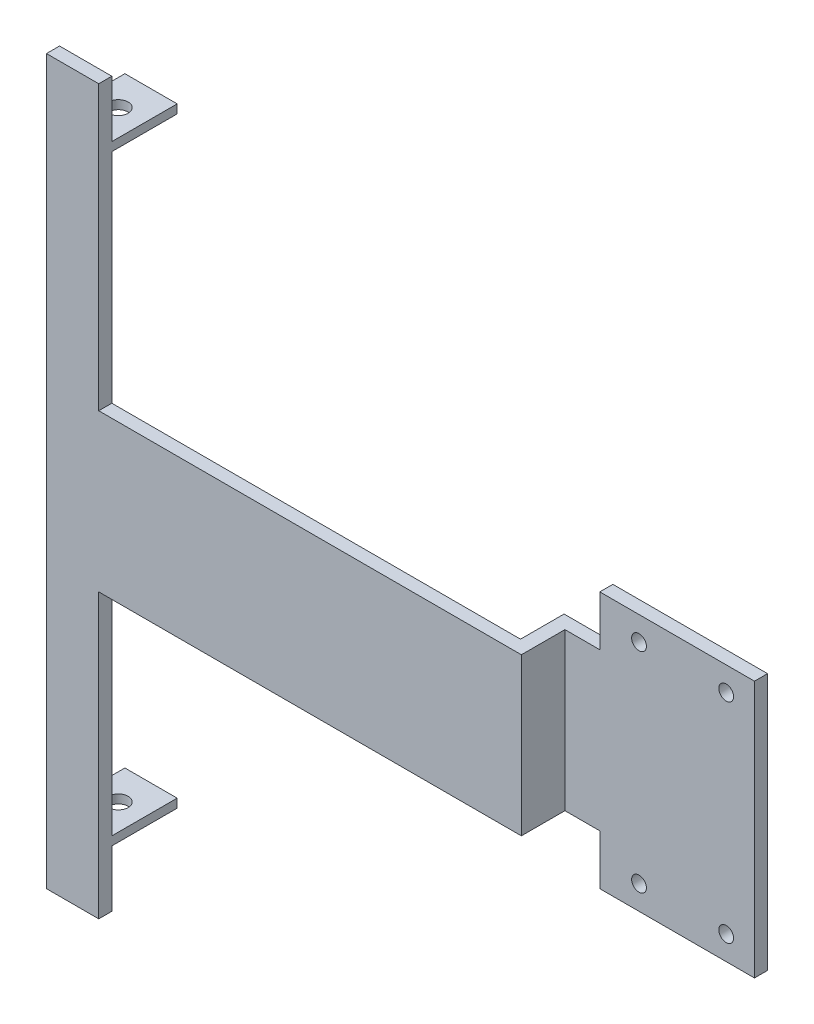
ISO-10303-21;
HEADER;
FILE_DESCRIPTION(('STEP AP214'),'2;1');
FILE_NAME('part.step','',(''),(''),'','','');
FILE_SCHEMA(('AUTOMOTIVE_DESIGN { 1 0 10303 214 1 1 1 1 }'));
ENDSEC;
DATA;
#1=APPLICATION_CONTEXT('core data for automotive mechanical design processes');
#2=APPLICATION_PROTOCOL_DEFINITION('international standard','automotive_design',2000,#1);
#3=PRODUCT_CONTEXT('',#1,'mechanical');
#4=PRODUCT('Part','Part','',(#3));
#5=PRODUCT_RELATED_PRODUCT_CATEGORY('part','',(#4));
#6=PRODUCT_DEFINITION_FORMATION('','',#4);
#7=PRODUCT_DEFINITION_CONTEXT('part definition',#1,'design');
#8=PRODUCT_DEFINITION('design','',#6,#7);
#9=PRODUCT_DEFINITION_SHAPE('','',#8);
#10=(LENGTH_UNIT() NAMED_UNIT(*) SI_UNIT(.MILLI.,.METRE.));
#11=(NAMED_UNIT(*) PLANE_ANGLE_UNIT() SI_UNIT($,.RADIAN.));
#12=(NAMED_UNIT(*) SI_UNIT($,.STERADIAN.) SOLID_ANGLE_UNIT());
#13=UNCERTAINTY_MEASURE_WITH_UNIT(LENGTH_MEASURE(1.E-05),#10,'distance_accuracy_value','');
#14=(GEOMETRIC_REPRESENTATION_CONTEXT(3) GLOBAL_UNCERTAINTY_ASSIGNED_CONTEXT((#13)) GLOBAL_UNIT_ASSIGNED_CONTEXT((#10,
#11,#12)) REPRESENTATION_CONTEXT('',''));
#15=CARTESIAN_POINT('',(0.,0.,0.));
#16=DIRECTION('',(0.,0.,1.));
#17=DIRECTION('',(1.,0.,0.));
#18=AXIS2_PLACEMENT_3D('',#15,#16,#17);
#19=CARTESIAN_POINT('',(46.,0.,120.));
#20=DIRECTION('',(1.,0.,0.));
#21=DIRECTION('',(0.,0.,-1.));
#22=AXIS2_PLACEMENT_3D('',#19,#20,#21);
#23=PLANE('',#22);
#24=DIRECTION('',(0.,0.,1.));
#25=VECTOR('',#24,1.);
#26=CARTESIAN_POINT('',(46.,-83.,120.));
#27=LINE('',#26,#25);
#28=CARTESIAN_POINT('',(46.,-83.,120.));
#29=VERTEX_POINT('',#28);
#30=CARTESIAN_POINT('',(46.,-83.,123.));
#31=VERTEX_POINT('',#30);
#32=EDGE_CURVE('E274',#29,#31,#27,.T.);
#33=ORIENTED_EDGE('',*,*,#32,.F.);
#34=DIRECTION('',(0.,1.,0.));
#35=VECTOR('',#34,1.);
#36=CARTESIAN_POINT('',(46.,0.,120.));
#37=LINE('',#36,#35);
#38=CARTESIAN_POINT('',(46.,-70.,120.));
#39=VERTEX_POINT('',#38);
#40=EDGE_CURVE('E354',#29,#39,#37,.T.);
#41=ORIENTED_EDGE('',*,*,#40,.T.);
#42=DIRECTION('',(0.,0.,1.));
#43=VECTOR('',#42,1.);
#44=CARTESIAN_POINT('',(46.,-70.,105.));
#45=LINE('',#44,#43);
#46=CARTESIAN_POINT('',(46.,-70.,105.));
#47=VERTEX_POINT('',#46);
#48=EDGE_CURVE('E330',#47,#39,#45,.T.);
#49=ORIENTED_EDGE('',*,*,#48,.F.);
#50=DIRECTION('',(0.,1.,0.));
#51=VECTOR('',#50,1.);
#52=CARTESIAN_POINT('',(46.,-69.,105.));
#53=LINE('',#52,#51);
#54=CARTESIAN_POINT('',(46.,-68.,105.));
#55=VERTEX_POINT('',#54);
#56=EDGE_CURVE('E327',#47,#55,#53,.T.);
#57=ORIENTED_EDGE('',*,*,#56,.T.);
#58=DIRECTION('',(0.,0.,1.));
#59=VECTOR('',#58,1.);
#60=CARTESIAN_POINT('',(46.,-68.,105.));
#61=LINE('',#60,#59);
#62=CARTESIAN_POINT('',(46.,-68.,120.));
#63=VERTEX_POINT('',#62);
#64=EDGE_CURVE('E338',#55,#63,#61,.T.);
#65=ORIENTED_EDGE('',*,*,#64,.T.);
#66=CARTESIAN_POINT('',(46.,-18.,120.));
#67=VERTEX_POINT('',#66);
#68=EDGE_CURVE('E357',#63,#67,#37,.T.);
#69=ORIENTED_EDGE('',*,*,#68,.T.);
#70=DIRECTION('',(0.,0.,-1.));
#71=VECTOR('',#70,1.);
#72=CARTESIAN_POINT('',(46.,-18.,120.));
#73=LINE('',#72,#71);
#74=CARTESIAN_POINT('',(46.,-18.,123.));
#75=VERTEX_POINT('',#74);
#76=EDGE_CURVE('E371',#75,#67,#73,.T.);
#77=ORIENTED_EDGE('',*,*,#76,.F.);
#78=DIRECTION('',(0.,-1.,0.));
#79=VECTOR('',#78,1.);
#80=CARTESIAN_POINT('',(46.,0.,123.));
#81=LINE('',#80,#79);
#82=EDGE_CURVE('E356',#75,#31,#81,.T.);
#83=ORIENTED_EDGE('',*,*,#82,.T.);
#84=EDGE_LOOP('',(#33,#41,#49,#57,#65,#69,#77,#83));
#85=FACE_BOUND('',#84,.T.);
#86=ADVANCED_FACE('F15',(#85),#23,.T.);
#87=CARTESIAN_POINT('',(40.,0.,120.));
#88=DIRECTION('',(0.,0.,-1.));
#89=DIRECTION('',(-1.,0.,0.));
#90=AXIS2_PLACEMENT_3D('',#87,#88,#89);
#91=PLANE('',#90);
#92=DIRECTION('',(0.,1.,0.));
#93=VECTOR('',#92,1.);
#94=CARTESIAN_POINT('',(139.8,0.,120.));
#95=LINE('',#94,#93);
#96=CARTESIAN_POINT('',(139.8,-18.,120.));
#97=VERTEX_POINT('',#96);
#98=CARTESIAN_POINT('',(139.8,18.,120.));
#99=VERTEX_POINT('',#98);
#100=EDGE_CURVE('E261',#97,#99,#95,.T.);
#101=ORIENTED_EDGE('',*,*,#100,.F.);
#102=DIRECTION('',(1.,0.,0.));
#103=VECTOR('',#102,1.);
#104=CARTESIAN_POINT('',(103.,-18.,120.));
#105=LINE('',#104,#103);
#106=EDGE_CURVE('E276',#67,#97,#105,.T.);
#107=ORIENTED_EDGE('',*,*,#106,.F.);
#108=ORIENTED_EDGE('',*,*,#68,.F.);
#109=DIRECTION('',(1.,0.,0.));
#110=VECTOR('',#109,1.);
#111=CARTESIAN_POINT('',(40.,-68.,120.));
#112=LINE('',#111,#110);
#113=CARTESIAN_POINT('',(34.,-68.,120.));
#114=VERTEX_POINT('',#113);
#115=EDGE_CURVE('E346',#114,#63,#112,.T.);
#116=ORIENTED_EDGE('',*,*,#115,.F.);
#117=DIRECTION('',(0.,-1.,0.));
#118=VECTOR('',#117,1.);
#119=CARTESIAN_POINT('',(34.,0.,120.));
#120=LINE('',#119,#118);
#121=CARTESIAN_POINT('',(34.,68.,120.));
#122=VERTEX_POINT('',#121);
#123=EDGE_CURVE('E362',#122,#114,#120,.T.);
#124=ORIENTED_EDGE('',*,*,#123,.F.);
#125=DIRECTION('',(-1.,0.,0.));
#126=VECTOR('',#125,1.);
#127=CARTESIAN_POINT('',(40.,68.,120.));
#128=LINE('',#127,#126);
#129=CARTESIAN_POINT('',(46.,68.,120.));
#130=VERTEX_POINT('',#129);
#131=EDGE_CURVE('E317',#130,#122,#128,.T.);
#132=ORIENTED_EDGE('',*,*,#131,.F.);
#133=CARTESIAN_POINT('',(46.,18.,120.));
#134=VERTEX_POINT('',#133);
#135=EDGE_CURVE('E358',#134,#130,#37,.T.);
#136=ORIENTED_EDGE('',*,*,#135,.F.);
#137=DIRECTION('',(-1.,0.,0.));
#138=VECTOR('',#137,1.);
#139=CARTESIAN_POINT('',(103.,18.,120.));
#140=LINE('',#139,#138);
#141=EDGE_CURVE('E279',#99,#134,#140,.T.);
#142=ORIENTED_EDGE('',*,*,#141,.F.);
#143=EDGE_LOOP('',(#101,#107,#108,#116,#124,#132,#136,#142));
#144=FACE_BOUND('',#143,.T.);
#145=ADVANCED_FACE('F429',(#144),#91,.T.);
#146=DIRECTION('',(1.,0.,0.));
#147=VECTOR('',#146,1.);
#148=CARTESIAN_POINT('',(40.,-83.,120.));
#149=LINE('',#148,#147);
#150=CARTESIAN_POINT('',(34.,-83.,120.));
#151=VERTEX_POINT('',#150);
#152=EDGE_CURVE('E272',#151,#29,#149,.T.);
#153=ORIENTED_EDGE('',*,*,#152,.F.);
#154=CARTESIAN_POINT('',(34.,-70.,120.));
#155=VERTEX_POINT('',#154);
#156=EDGE_CURVE('E353',#155,#151,#120,.T.);
#157=ORIENTED_EDGE('',*,*,#156,.F.);
#158=DIRECTION('',(-1.,0.,0.));
#159=VECTOR('',#158,1.);
#160=CARTESIAN_POINT('',(40.,-70.,120.));
#161=LINE('',#160,#159);
#162=EDGE_CURVE('E351',#39,#155,#161,.T.);
#163=ORIENTED_EDGE('',*,*,#162,.F.);
#164=ORIENTED_EDGE('',*,*,#40,.F.);
#165=EDGE_LOOP('',(#153,#157,#163,#164));
#166=FACE_BOUND('',#165,.T.);
#167=ADVANCED_FACE('F438',(#166),#91,.T.);
#168=CARTESIAN_POINT('',(40.,0.,123.));
#169=DIRECTION('',(0.,0.,1.));
#170=DIRECTION('',(1.,0.,0.));
#171=AXIS2_PLACEMENT_3D('',#168,#169,#170);
#172=PLANE('',#171);
#173=ORIENTED_EDGE('',*,*,#82,.F.);
#174=DIRECTION('',(-1.,0.,0.));
#175=VECTOR('',#174,1.);
#176=CARTESIAN_POINT('',(103.,-18.,123.));
#177=LINE('',#176,#175);
#178=CARTESIAN_POINT('',(143.,-18.,123.));
#179=VERTEX_POINT('',#178);
#180=EDGE_CURVE('E283',#179,#75,#177,.T.);
#181=ORIENTED_EDGE('',*,*,#180,.F.);
#182=DIRECTION('',(0.,-1.,0.));
#183=VECTOR('',#182,1.);
#184=CARTESIAN_POINT('',(143.,0.,123.));
#185=LINE('',#184,#183);
#186=CARTESIAN_POINT('',(143.,18.,123.));
#187=VERTEX_POINT('',#186);
#188=EDGE_CURVE('E258',#187,#179,#185,.T.);
#189=ORIENTED_EDGE('',*,*,#188,.F.);
#190=DIRECTION('',(1.,0.,0.));
#191=VECTOR('',#190,1.);
#192=CARTESIAN_POINT('',(103.,18.,123.));
#193=LINE('',#192,#191);
#194=CARTESIAN_POINT('',(46.,18.,123.));
#195=VERTEX_POINT('',#194);
#196=EDGE_CURVE('E281',#195,#187,#193,.T.);
#197=ORIENTED_EDGE('',*,*,#196,.F.);
#198=CARTESIAN_POINT('',(46.,83.,123.));
#199=VERTEX_POINT('',#198);
#200=EDGE_CURVE('E363',#199,#195,#81,.T.);
#201=ORIENTED_EDGE('',*,*,#200,.F.);
#202=DIRECTION('',(1.,0.,0.));
#203=VECTOR('',#202,1.);
#204=CARTESIAN_POINT('',(40.,83.,123.));
#205=LINE('',#204,#203);
#206=CARTESIAN_POINT('',(34.,83.,123.));
#207=VERTEX_POINT('',#206);
#208=EDGE_CURVE('E268',#207,#199,#205,.T.);
#209=ORIENTED_EDGE('',*,*,#208,.F.);
#210=DIRECTION('',(0.,1.,0.));
#211=VECTOR('',#210,1.);
#212=CARTESIAN_POINT('',(34.,0.,123.));
#213=LINE('',#212,#211);
#214=CARTESIAN_POINT('',(34.,-83.,123.));
#215=VERTEX_POINT('',#214);
#216=EDGE_CURVE('E365',#215,#207,#213,.T.);
#217=ORIENTED_EDGE('',*,*,#216,.F.);
#218=DIRECTION('',(-1.,0.,0.));
#219=VECTOR('',#218,1.);
#220=CARTESIAN_POINT('',(40.,-83.,123.));
#221=LINE('',#220,#219);
#222=EDGE_CURVE('E270',#31,#215,#221,.T.);
#223=ORIENTED_EDGE('',*,*,#222,.F.);
#224=EDGE_LOOP('',(#173,#181,#189,#197,#201,#209,#217,#223));
#225=FACE_BOUND('',#224,.T.);
#226=ADVANCED_FACE('F17',(#225),#172,.T.);
#227=CARTESIAN_POINT('',(34.,0.,120.));
#228=DIRECTION('',(-1.,0.,0.));
#229=DIRECTION('',(0.,0.,1.));
#230=AXIS2_PLACEMENT_3D('',#227,#228,#229);
#231=PLANE('',#230);
#232=DIRECTION('',(0.,0.,1.));
#233=VECTOR('',#232,1.);
#234=CARTESIAN_POINT('',(34.,83.,120.));
#235=LINE('',#234,#233);
#236=CARTESIAN_POINT('',(34.,83.,120.));
#237=VERTEX_POINT('',#236);
#238=EDGE_CURVE('E266',#237,#207,#235,.T.);
#239=ORIENTED_EDGE('',*,*,#238,.F.);
#240=CARTESIAN_POINT('',(34.,70.,120.));
#241=VERTEX_POINT('',#240);
#242=EDGE_CURVE('E359',#237,#241,#120,.T.);
#243=ORIENTED_EDGE('',*,*,#242,.T.);
#244=DIRECTION('',(0.,0.,1.));
#245=VECTOR('',#244,1.);
#246=CARTESIAN_POINT('',(34.,70.,105.));
#247=LINE('',#246,#245);
#248=CARTESIAN_POINT('',(34.,70.,105.));
#249=VERTEX_POINT('',#248);
#250=EDGE_CURVE('E306',#249,#241,#247,.T.);
#251=ORIENTED_EDGE('',*,*,#250,.F.);
#252=DIRECTION('',(0.,-1.,0.));
#253=VECTOR('',#252,1.);
#254=CARTESIAN_POINT('',(34.,69.,105.));
#255=LINE('',#254,#253);
#256=CARTESIAN_POINT('',(34.,68.,105.));
#257=VERTEX_POINT('',#256);
#258=EDGE_CURVE('E292',#249,#257,#255,.T.);
#259=ORIENTED_EDGE('',*,*,#258,.T.);
#260=DIRECTION('',(0.,0.,1.));
#261=VECTOR('',#260,1.);
#262=CARTESIAN_POINT('',(34.,68.,105.));
#263=LINE('',#262,#261);
#264=EDGE_CURVE('E309',#257,#122,#263,.T.);
#265=ORIENTED_EDGE('',*,*,#264,.T.);
#266=ORIENTED_EDGE('',*,*,#123,.T.);
#267=DIRECTION('',(0.,0.,1.));
#268=VECTOR('',#267,1.);
#269=CARTESIAN_POINT('',(34.,-68.,105.));
#270=LINE('',#269,#268);
#271=CARTESIAN_POINT('',(34.,-68.,105.));
#272=VERTEX_POINT('',#271);
#273=EDGE_CURVE('E340',#272,#114,#270,.T.);
#274=ORIENTED_EDGE('',*,*,#273,.F.);
#275=DIRECTION('',(0.,-1.,0.));
#276=VECTOR('',#275,1.);
#277=CARTESIAN_POINT('',(34.,-69.,105.));
#278=LINE('',#277,#276);
#279=CARTESIAN_POINT('',(34.,-70.,105.));
#280=VERTEX_POINT('',#279);
#281=EDGE_CURVE('E326',#272,#280,#278,.T.);
#282=ORIENTED_EDGE('',*,*,#281,.T.);
#283=DIRECTION('',(0.,0.,1.));
#284=VECTOR('',#283,1.);
#285=CARTESIAN_POINT('',(34.,-70.,105.));
#286=LINE('',#285,#284);
#287=EDGE_CURVE('E343',#280,#155,#286,.T.);
#288=ORIENTED_EDGE('',*,*,#287,.T.);
#289=ORIENTED_EDGE('',*,*,#156,.T.);
#290=DIRECTION('',(0.,0.,-1.));
#291=VECTOR('',#290,1.);
#292=CARTESIAN_POINT('',(34.,-83.,120.));
#293=LINE('',#292,#291);
#294=EDGE_CURVE('E374',#215,#151,#293,.T.);
#295=ORIENTED_EDGE('',*,*,#294,.F.);
#296=ORIENTED_EDGE('',*,*,#216,.T.);
#297=EDGE_LOOP('',(#239,#243,#251,#259,#265,#266,#274,#282,#288,#289,#295,#296));
#298=FACE_BOUND('',#297,.T.);
#299=ADVANCED_FACE('F454',(#298),#231,.T.);
#300=DIRECTION('',(-1.,0.,0.));
#301=VECTOR('',#300,1.);
#302=CARTESIAN_POINT('',(40.,83.,120.));
#303=LINE('',#302,#301);
#304=CARTESIAN_POINT('',(46.,83.,120.));
#305=VERTEX_POINT('',#304);
#306=EDGE_CURVE('E264',#305,#237,#303,.T.);
#307=ORIENTED_EDGE('',*,*,#306,.F.);
#308=CARTESIAN_POINT('',(46.,70.,120.));
#309=VERTEX_POINT('',#308);
#310=EDGE_CURVE('E361',#309,#305,#37,.T.);
#311=ORIENTED_EDGE('',*,*,#310,.F.);
#312=DIRECTION('',(1.,0.,0.));
#313=VECTOR('',#312,1.);
#314=CARTESIAN_POINT('',(40.,70.,120.));
#315=LINE('',#314,#313);
#316=EDGE_CURVE('E312',#241,#309,#315,.T.);
#317=ORIENTED_EDGE('',*,*,#316,.F.);
#318=ORIENTED_EDGE('',*,*,#242,.F.);
#319=EDGE_LOOP('',(#307,#311,#317,#318));
#320=FACE_BOUND('',#319,.T.);
#321=ADVANCED_FACE('F441',(#320),#91,.T.);
#322=DIRECTION('',(0.,0.,-1.));
#323=VECTOR('',#322,1.);
#324=CARTESIAN_POINT('',(46.,83.,120.));
#325=LINE('',#324,#323);
#326=EDGE_CURVE('E376',#199,#305,#325,.T.);
#327=ORIENTED_EDGE('',*,*,#326,.F.);
#328=ORIENTED_EDGE('',*,*,#200,.T.);
#329=DIRECTION('',(0.,0.,1.));
#330=VECTOR('',#329,1.);
#331=CARTESIAN_POINT('',(46.,18.,120.));
#332=LINE('',#331,#330);
#333=EDGE_CURVE('E368',#134,#195,#332,.T.);
#334=ORIENTED_EDGE('',*,*,#333,.F.);
#335=ORIENTED_EDGE('',*,*,#135,.T.);
#336=DIRECTION('',(0.,0.,1.));
#337=VECTOR('',#336,1.);
#338=CARTESIAN_POINT('',(46.,68.,105.));
#339=LINE('',#338,#337);
#340=CARTESIAN_POINT('',(46.,68.,105.));
#341=VERTEX_POINT('',#340);
#342=EDGE_CURVE('E296',#341,#130,#339,.T.);
#343=ORIENTED_EDGE('',*,*,#342,.F.);
#344=DIRECTION('',(0.,1.,0.));
#345=VECTOR('',#344,1.);
#346=CARTESIAN_POINT('',(46.,69.,105.));
#347=LINE('',#346,#345);
#348=CARTESIAN_POINT('',(46.,70.,105.));
#349=VERTEX_POINT('',#348);
#350=EDGE_CURVE('E293',#341,#349,#347,.T.);
#351=ORIENTED_EDGE('',*,*,#350,.T.);
#352=DIRECTION('',(0.,0.,1.));
#353=VECTOR('',#352,1.);
#354=CARTESIAN_POINT('',(46.,70.,105.));
#355=LINE('',#354,#353);
#356=EDGE_CURVE('E304',#349,#309,#355,.T.);
#357=ORIENTED_EDGE('',*,*,#356,.T.);
#358=ORIENTED_EDGE('',*,*,#310,.T.);
#359=EDGE_LOOP('',(#327,#328,#334,#335,#343,#351,#357,#358));
#360=FACE_BOUND('',#359,.T.);
#361=ADVANCED_FACE('F432',(#360),#23,.T.);
#362=CARTESIAN_POINT('',(40.,-70.,105.));
#363=DIRECTION('',(0.,-1.,0.));
#364=DIRECTION('',(0.,0.,-1.));
#365=AXIS2_PLACEMENT_3D('',#362,#363,#364);
#366=PLANE('',#365);
#367=CARTESIAN_POINT('',(40.,-70.,112.5));
#368=DIRECTION('',(0.,-1.,0.));
#369=DIRECTION('',(0.,0.,-1.));
#370=AXIS2_PLACEMENT_3D('',#367,#368,#369);
#371=CIRCLE('',#370,2.25);
#372=CARTESIAN_POINT('',(40.,-70.,110.25));
#373=VERTEX_POINT('',#372);
#374=EDGE_CURVE('E320',#373,#373,#371,.T.);
#375=ORIENTED_EDGE('',*,*,#374,.F.);
#376=EDGE_LOOP('',(#375));
#377=FACE_BOUND('',#376,.T.);
#378=ORIENTED_EDGE('',*,*,#48,.T.);
#379=ORIENTED_EDGE('',*,*,#162,.T.);
#380=ORIENTED_EDGE('',*,*,#287,.F.);
#381=DIRECTION('',(1.,0.,0.));
#382=VECTOR('',#381,1.);
#383=CARTESIAN_POINT('',(40.,-70.,105.));
#384=LINE('',#383,#382);
#385=EDGE_CURVE('E323',#280,#47,#384,.T.);
#386=ORIENTED_EDGE('',*,*,#385,.T.);
#387=EDGE_LOOP('',(#378,#379,#380,#386));
#388=FACE_BOUND('',#387,.T.);
#389=ADVANCED_FACE('F444',(#377,#388),#366,.T.);
#390=CARTESIAN_POINT('',(40.,-68.,105.));
#391=DIRECTION('',(0.,1.,0.));
#392=DIRECTION('',(0.,0.,1.));
#393=AXIS2_PLACEMENT_3D('',#390,#391,#392);
#394=PLANE('',#393);
#395=CARTESIAN_POINT('',(40.,-68.,112.5));
#396=DIRECTION('',(0.,1.,0.));
#397=DIRECTION('',(0.,0.,1.));
#398=AXIS2_PLACEMENT_3D('',#395,#396,#397);
#399=CIRCLE('',#398,2.25);
#400=CARTESIAN_POINT('',(40.,-68.,114.75));
#401=VERTEX_POINT('',#400);
#402=EDGE_CURVE('E319',#401,#401,#399,.T.);
#403=ORIENTED_EDGE('',*,*,#402,.F.);
#404=EDGE_LOOP('',(#403));
#405=FACE_BOUND('',#404,.T.);
#406=ORIENTED_EDGE('',*,*,#273,.T.);
#407=ORIENTED_EDGE('',*,*,#115,.T.);
#408=ORIENTED_EDGE('',*,*,#64,.F.);
#409=DIRECTION('',(-1.,0.,0.));
#410=VECTOR('',#409,1.);
#411=CARTESIAN_POINT('',(40.,-68.,105.));
#412=LINE('',#411,#410);
#413=EDGE_CURVE('E331',#55,#272,#412,.T.);
#414=ORIENTED_EDGE('',*,*,#413,.T.);
#415=EDGE_LOOP('',(#406,#407,#408,#414));
#416=FACE_BOUND('',#415,.T.);
#417=ADVANCED_FACE('F451',(#405,#416),#394,.T.);
#418=CARTESIAN_POINT('',(40.,-69.,105.));
#419=DIRECTION('',(0.,0.,-1.));
#420=DIRECTION('',(-1.,0.,0.));
#421=AXIS2_PLACEMENT_3D('',#418,#419,#420);
#422=PLANE('',#421);
#423=ORIENTED_EDGE('',*,*,#56,.F.);
#424=ORIENTED_EDGE('',*,*,#385,.F.);
#425=ORIENTED_EDGE('',*,*,#281,.F.);
#426=ORIENTED_EDGE('',*,*,#413,.F.);
#427=EDGE_LOOP('',(#423,#424,#425,#426));
#428=FACE_BOUND('',#427,.T.);
#429=ADVANCED_FACE('F519',(#428),#422,.T.);
#430=CARTESIAN_POINT('',(40.,-71.,112.5));
#431=DIRECTION('',(0.,1.,0.));
#432=DIRECTION('',(0.,0.,1.));
#433=AXIS2_PLACEMENT_3D('',#430,#431,#432);
#434=CYLINDRICAL_SURFACE('',#433,2.25);
#435=ORIENTED_EDGE('',*,*,#374,.T.);
#436=EDGE_LOOP('',(#435));
#437=FACE_BOUND('',#436,.T.);
#438=ORIENTED_EDGE('',*,*,#402,.T.);
#439=EDGE_LOOP('',(#438));
#440=FACE_BOUND('',#439,.T.);
#441=ADVANCED_FACE('F515',(#437,#440),#434,.F.);
#442=CARTESIAN_POINT('',(40.,68.,105.));
#443=DIRECTION('',(0.,-1.,0.));
#444=DIRECTION('',(0.,0.,-1.));
#445=AXIS2_PLACEMENT_3D('',#442,#443,#444);
#446=PLANE('',#445);
#447=CARTESIAN_POINT('',(40.,68.,112.5));
#448=DIRECTION('',(0.,-1.,0.));
#449=DIRECTION('',(0.,0.,-1.));
#450=AXIS2_PLACEMENT_3D('',#447,#448,#449);
#451=CIRCLE('',#450,2.25);
#452=CARTESIAN_POINT('',(40.,68.,110.25));
#453=VERTEX_POINT('',#452);
#454=EDGE_CURVE('E286',#453,#453,#451,.T.);
#455=ORIENTED_EDGE('',*,*,#454,.F.);
#456=EDGE_LOOP('',(#455));
#457=FACE_BOUND('',#456,.T.);
#458=ORIENTED_EDGE('',*,*,#342,.T.);
#459=ORIENTED_EDGE('',*,*,#131,.T.);
#460=ORIENTED_EDGE('',*,*,#264,.F.);
#461=DIRECTION('',(1.,0.,0.));
#462=VECTOR('',#461,1.);
#463=CARTESIAN_POINT('',(40.,68.,105.));
#464=LINE('',#463,#462);
#465=EDGE_CURVE('E289',#257,#341,#464,.T.);
#466=ORIENTED_EDGE('',*,*,#465,.T.);
#467=EDGE_LOOP('',(#458,#459,#460,#466));
#468=FACE_BOUND('',#467,.T.);
#469=ADVANCED_FACE('F471',(#457,#468),#446,.T.);
#470=CARTESIAN_POINT('',(40.,70.,105.));
#471=DIRECTION('',(0.,1.,0.));
#472=DIRECTION('',(0.,0.,1.));
#473=AXIS2_PLACEMENT_3D('',#470,#471,#472);
#474=PLANE('',#473);
#475=CARTESIAN_POINT('',(40.,70.,112.5));
#476=DIRECTION('',(0.,1.,0.));
#477=DIRECTION('',(0.,0.,1.));
#478=AXIS2_PLACEMENT_3D('',#475,#476,#477);
#479=CIRCLE('',#478,2.25);
#480=CARTESIAN_POINT('',(40.,70.,114.75));
#481=VERTEX_POINT('',#480);
#482=EDGE_CURVE('E285',#481,#481,#479,.T.);
#483=ORIENTED_EDGE('',*,*,#482,.F.);
#484=EDGE_LOOP('',(#483));
#485=FACE_BOUND('',#484,.T.);
#486=ORIENTED_EDGE('',*,*,#250,.T.);
#487=ORIENTED_EDGE('',*,*,#316,.T.);
#488=ORIENTED_EDGE('',*,*,#356,.F.);
#489=DIRECTION('',(-1.,0.,0.));
#490=VECTOR('',#489,1.);
#491=CARTESIAN_POINT('',(40.,70.,105.));
#492=LINE('',#491,#490);
#493=EDGE_CURVE('E297',#349,#249,#492,.T.);
#494=ORIENTED_EDGE('',*,*,#493,.T.);
#495=EDGE_LOOP('',(#486,#487,#488,#494));
#496=FACE_BOUND('',#495,.T.);
#497=ADVANCED_FACE('F494',(#485,#496),#474,.T.);
#498=CARTESIAN_POINT('',(40.,69.,105.));
#499=DIRECTION('',(0.,0.,-1.));
#500=DIRECTION('',(-1.,0.,0.));
#501=AXIS2_PLACEMENT_3D('',#498,#499,#500);
#502=PLANE('',#501);
#503=ORIENTED_EDGE('',*,*,#350,.F.);
#504=ORIENTED_EDGE('',*,*,#465,.F.);
#505=ORIENTED_EDGE('',*,*,#258,.F.);
#506=ORIENTED_EDGE('',*,*,#493,.F.);
#507=EDGE_LOOP('',(#503,#504,#505,#506));
#508=FACE_BOUND('',#507,.T.);
#509=ADVANCED_FACE('F498',(#508),#502,.T.);
#510=CARTESIAN_POINT('',(40.,67.,112.5));
#511=DIRECTION('',(0.,1.,0.));
#512=DIRECTION('',(0.,0.,1.));
#513=AXIS2_PLACEMENT_3D('',#510,#511,#512);
#514=CYLINDRICAL_SURFACE('',#513,2.25);
#515=ORIENTED_EDGE('',*,*,#454,.T.);
#516=EDGE_LOOP('',(#515));
#517=FACE_BOUND('',#516,.T.);
#518=ORIENTED_EDGE('',*,*,#482,.T.);
#519=EDGE_LOOP('',(#518));
#520=FACE_BOUND('',#519,.T.);
#521=ADVANCED_FACE('F500',(#517,#520),#514,.F.);
#522=CARTESIAN_POINT('',(103.,-18.,120.));
#523=DIRECTION('',(0.,-1.,0.));
#524=DIRECTION('',(0.,0.,-1.));
#525=AXIS2_PLACEMENT_3D('',#522,#523,#524);
#526=PLANE('',#525);
#527=DIRECTION('',(0.,0.,1.));
#528=VECTOR('',#527,1.);
#529=CARTESIAN_POINT('',(143.,-18.,110.));
#530=LINE('',#529,#528);
#531=CARTESIAN_POINT('',(143.,-18.,113.));
#532=VERTEX_POINT('',#531);
#533=EDGE_CURVE('E191',#532,#179,#530,.T.);
#534=ORIENTED_EDGE('',*,*,#533,.T.);
#535=ORIENTED_EDGE('',*,*,#180,.T.);
#536=ORIENTED_EDGE('',*,*,#76,.T.);
#537=ORIENTED_EDGE('',*,*,#106,.T.);
#538=DIRECTION('',(0.,0.,1.));
#539=VECTOR('',#538,1.);
#540=CARTESIAN_POINT('',(139.8,-18.,110.));
#541=LINE('',#540,#539);
#542=CARTESIAN_POINT('',(139.8,-18.,110.));
#543=VERTEX_POINT('',#542);
#544=EDGE_CURVE('E255',#543,#97,#541,.T.);
#545=ORIENTED_EDGE('',*,*,#544,.F.);
#546=DIRECTION('',(1.,0.,0.));
#547=VECTOR('',#546,1.);
#548=CARTESIAN_POINT('',(141.4,-18.,110.));
#549=LINE('',#548,#547);
#550=CARTESIAN_POINT('',(151.,-18.,110.));
#551=VERTEX_POINT('',#550);
#552=EDGE_CURVE('E247',#543,#551,#549,.T.);
#553=ORIENTED_EDGE('',*,*,#552,.T.);
#554=DIRECTION('',(0.,0.,1.));
#555=VECTOR('',#554,1.);
#556=CARTESIAN_POINT('',(151.,-18.,109.5));
#557=LINE('',#556,#555);
#558=CARTESIAN_POINT('',(151.,-18.,113.));
#559=VERTEX_POINT('',#558);
#560=EDGE_CURVE('E204',#551,#559,#557,.T.);
#561=ORIENTED_EDGE('',*,*,#560,.T.);
#562=DIRECTION('',(-1.,0.,0.));
#563=VECTOR('',#562,1.);
#564=CARTESIAN_POINT('',(163.25,-18.,113.));
#565=LINE('',#564,#563);
#566=EDGE_CURVE('E23',#559,#532,#565,.T.);
#567=ORIENTED_EDGE('',*,*,#566,.T.);
#568=EDGE_LOOP('',(#534,#535,#536,#537,#545,#553,#561,#567));
#569=FACE_BOUND('',#568,.T.);
#570=ADVANCED_FACE('F393',(#569),#526,.T.);
#571=CARTESIAN_POINT('',(103.,18.,120.));
#572=DIRECTION('',(0.,1.,0.));
#573=DIRECTION('',(0.,0.,1.));
#574=AXIS2_PLACEMENT_3D('',#571,#572,#573);
#575=PLANE('',#574);
#576=ORIENTED_EDGE('',*,*,#196,.T.);
#577=DIRECTION('',(0.,0.,1.));
#578=VECTOR('',#577,1.);
#579=CARTESIAN_POINT('',(143.,18.,110.));
#580=LINE('',#579,#578);
#581=CARTESIAN_POINT('',(143.,18.,113.));
#582=VERTEX_POINT('',#581);
#583=EDGE_CURVE('E251',#582,#187,#580,.T.);
#584=ORIENTED_EDGE('',*,*,#583,.F.);
#585=DIRECTION('',(1.,0.,0.));
#586=VECTOR('',#585,1.);
#587=CARTESIAN_POINT('',(163.25,18.,113.));
#588=LINE('',#587,#586);
#589=CARTESIAN_POINT('',(151.,18.,113.));
#590=VERTEX_POINT('',#589);
#591=EDGE_CURVE('E195',#582,#590,#588,.T.);
#592=ORIENTED_EDGE('',*,*,#591,.T.);
#593=DIRECTION('',(0.,0.,1.));
#594=VECTOR('',#593,1.);
#595=CARTESIAN_POINT('',(151.,18.,109.5));
#596=LINE('',#595,#594);
#597=CARTESIAN_POINT('',(151.,18.,110.));
#598=VERTEX_POINT('',#597);
#599=EDGE_CURVE('E194',#598,#590,#596,.T.);
#600=ORIENTED_EDGE('',*,*,#599,.F.);
#601=DIRECTION('',(-1.,0.,0.));
#602=VECTOR('',#601,1.);
#603=CARTESIAN_POINT('',(141.4,18.,110.));
#604=LINE('',#603,#602);
#605=CARTESIAN_POINT('',(139.8,18.,110.));
#606=VERTEX_POINT('',#605);
#607=EDGE_CURVE('E177',#598,#606,#604,.T.);
#608=ORIENTED_EDGE('',*,*,#607,.T.);
#609=DIRECTION('',(0.,0.,1.));
#610=VECTOR('',#609,1.);
#611=CARTESIAN_POINT('',(139.8,18.,110.));
#612=LINE('',#611,#610);
#613=EDGE_CURVE('E253',#606,#99,#612,.T.);
#614=ORIENTED_EDGE('',*,*,#613,.T.);
#615=ORIENTED_EDGE('',*,*,#141,.T.);
#616=ORIENTED_EDGE('',*,*,#333,.T.);
#617=EDGE_LOOP('',(#576,#584,#592,#600,#608,#614,#615,#616));
#618=FACE_BOUND('',#617,.T.);
#619=ADVANCED_FACE('F198',(#618),#575,.T.);
#620=CARTESIAN_POINT('',(40.,-83.,119.));
#621=DIRECTION('',(0.,1.,0.));
#622=DIRECTION('',(0.,0.,1.));
#623=AXIS2_PLACEMENT_3D('',#620,#621,#622);
#624=PLANE('',#623);
#625=ORIENTED_EDGE('',*,*,#32,.T.);
#626=ORIENTED_EDGE('',*,*,#222,.T.);
#627=ORIENTED_EDGE('',*,*,#294,.T.);
#628=ORIENTED_EDGE('',*,*,#152,.T.);
#629=EDGE_LOOP('',(#625,#626,#627,#628));
#630=FACE_BOUND('',#629,.T.);
#631=ADVANCED_FACE('F487',(#630),#624,.F.);
#632=CARTESIAN_POINT('',(40.,83.,119.));
#633=DIRECTION('',(0.,-1.,0.));
#634=DIRECTION('',(0.,0.,-1.));
#635=AXIS2_PLACEMENT_3D('',#632,#633,#634);
#636=PLANE('',#635);
#637=ORIENTED_EDGE('',*,*,#208,.T.);
#638=ORIENTED_EDGE('',*,*,#326,.T.);
#639=ORIENTED_EDGE('',*,*,#306,.T.);
#640=ORIENTED_EDGE('',*,*,#238,.T.);
#641=EDGE_LOOP('',(#637,#638,#639,#640));
#642=FACE_BOUND('',#641,.T.);
#643=ADVANCED_FACE('F540',(#642),#636,.F.);
#644=CARTESIAN_POINT('',(139.8,0.,110.));
#645=DIRECTION('',(-1.,0.,0.));
#646=DIRECTION('',(0.,0.,1.));
#647=AXIS2_PLACEMENT_3D('',#644,#645,#646);
#648=PLANE('',#647);
#649=ORIENTED_EDGE('',*,*,#544,.T.);
#650=ORIENTED_EDGE('',*,*,#100,.T.);
#651=ORIENTED_EDGE('',*,*,#613,.F.);
#652=DIRECTION('',(0.,-1.,0.));
#653=VECTOR('',#652,1.);
#654=CARTESIAN_POINT('',(139.8,0.,110.));
#655=LINE('',#654,#653);
#656=EDGE_CURVE('E186',#606,#543,#655,.T.);
#657=ORIENTED_EDGE('',*,*,#656,.T.);
#658=EDGE_LOOP('',(#649,#650,#651,#657));
#659=FACE_BOUND('',#658,.T.);
#660=ADVANCED_FACE('F538',(#659),#648,.T.);
#661=CARTESIAN_POINT('',(141.4,0.,110.));
#662=DIRECTION('',(0.,0.,-1.));
#663=DIRECTION('',(-1.,0.,0.));
#664=AXIS2_PLACEMENT_3D('',#661,#662,#663);
#665=PLANE('',#664);
#666=ORIENTED_EDGE('',*,*,#607,.F.);
#667=DIRECTION('',(0.,-1.,0.));
#668=VECTOR('',#667,1.);
#669=CARTESIAN_POINT('',(151.,0.,110.));
#670=LINE('',#669,#668);
#671=CARTESIAN_POINT('',(151.,29.5,110.));
#672=VERTEX_POINT('',#671);
#673=EDGE_CURVE('E182',#672,#598,#670,.T.);
#674=ORIENTED_EDGE('',*,*,#673,.F.);
#675=DIRECTION('',(-1.,0.,0.));
#676=VECTOR('',#675,1.);
#677=CARTESIAN_POINT('',(163.25,29.5,110.));
#678=LINE('',#677,#676);
#679=CARTESIAN_POINT('',(186.5,29.5,110.));
#680=VERTEX_POINT('',#679);
#681=EDGE_CURVE('E228',#680,#672,#678,.T.);
#682=ORIENTED_EDGE('',*,*,#681,.F.);
#683=DIRECTION('',(0.,1.,0.));
#684=VECTOR('',#683,1.);
#685=CARTESIAN_POINT('',(186.5,0.,110.));
#686=LINE('',#685,#684);
#687=CARTESIAN_POINT('',(186.5,-29.5,110.));
#688=VERTEX_POINT('',#687);
#689=EDGE_CURVE('E229',#688,#680,#686,.T.);
#690=ORIENTED_EDGE('',*,*,#689,.F.);
#691=DIRECTION('',(1.,0.,0.));
#692=VECTOR('',#691,1.);
#693=CARTESIAN_POINT('',(163.25,-29.5,110.));
#694=LINE('',#693,#692);
#695=CARTESIAN_POINT('',(151.,-29.5,110.));
#696=VERTEX_POINT('',#695);
#697=EDGE_CURVE('E226',#696,#688,#694,.T.);
#698=ORIENTED_EDGE('',*,*,#697,.F.);
#699=DIRECTION('',(0.,-1.,0.));
#700=VECTOR('',#699,1.);
#701=CARTESIAN_POINT('',(151.,0.,110.));
#702=LINE('',#701,#700);
#703=EDGE_CURVE('E37',#551,#696,#702,.T.);
#704=ORIENTED_EDGE('',*,*,#703,.F.);
#705=ORIENTED_EDGE('',*,*,#552,.F.);
#706=ORIENTED_EDGE('',*,*,#656,.F.);
#707=EDGE_LOOP('',(#666,#674,#682,#690,#698,#704,#705,#706));
#708=FACE_BOUND('',#707,.T.);
#709=CARTESIAN_POINT('',(180.,24.,110.));
#710=DIRECTION('',(0.,0.,-1.));
#711=DIRECTION('',(-1.,0.,0.));
#712=AXIS2_PLACEMENT_3D('',#709,#710,#711);
#713=CIRCLE('',#712,1.7);
#714=CARTESIAN_POINT('',(178.3,24.,110.));
#715=VERTEX_POINT('',#714);
#716=EDGE_CURVE('E211',#715,#715,#713,.T.);
#717=ORIENTED_EDGE('',*,*,#716,.F.);
#718=EDGE_LOOP('',(#717));
#719=FACE_BOUND('',#718,.T.);
#720=CARTESIAN_POINT('',(180.,-24.,110.));
#721=DIRECTION('',(0.,0.,-1.));
#722=DIRECTION('',(-1.,0.,0.));
#723=AXIS2_PLACEMENT_3D('',#720,#721,#722);
#724=CIRCLE('',#723,1.7);
#725=CARTESIAN_POINT('',(178.3,-24.,110.));
#726=VERTEX_POINT('',#725);
#727=EDGE_CURVE('E215',#726,#726,#724,.T.);
#728=ORIENTED_EDGE('',*,*,#727,.F.);
#729=EDGE_LOOP('',(#728));
#730=FACE_BOUND('',#729,.T.);
#731=CARTESIAN_POINT('',(160.,24.,110.));
#732=DIRECTION('',(0.,0.,-1.));
#733=DIRECTION('',(-1.,0.,0.));
#734=AXIS2_PLACEMENT_3D('',#731,#732,#733);
#735=CIRCLE('',#734,1.7);
#736=CARTESIAN_POINT('',(158.3,24.,110.));
#737=VERTEX_POINT('',#736);
#738=EDGE_CURVE('E219',#737,#737,#735,.T.);
#739=ORIENTED_EDGE('',*,*,#738,.F.);
#740=EDGE_LOOP('',(#739));
#741=FACE_BOUND('',#740,.T.);
#742=CARTESIAN_POINT('',(160.,-24.,110.));
#743=DIRECTION('',(0.,0.,-1.));
#744=DIRECTION('',(-1.,0.,0.));
#745=AXIS2_PLACEMENT_3D('',#742,#743,#744);
#746=CIRCLE('',#745,1.7);
#747=CARTESIAN_POINT('',(158.3,-24.,110.));
#748=VERTEX_POINT('',#747);
#749=EDGE_CURVE('E223',#748,#748,#746,.T.);
#750=ORIENTED_EDGE('',*,*,#749,.F.);
#751=EDGE_LOOP('',(#750));
#752=FACE_BOUND('',#751,.T.);
#753=ADVANCED_FACE('F179',(#708,#719,#730,#741,#752),#665,.T.);
#754=CARTESIAN_POINT('',(143.,0.,110.));
#755=DIRECTION('',(1.,0.,0.));
#756=DIRECTION('',(0.,0.,-1.));
#757=AXIS2_PLACEMENT_3D('',#754,#755,#756);
#758=PLANE('',#757);
#759=DIRECTION('',(0.,-1.,0.));
#760=VECTOR('',#759,1.);
#761=CARTESIAN_POINT('',(143.,0.,113.));
#762=LINE('',#761,#760);
#763=EDGE_CURVE('E378',#582,#532,#762,.T.);
#764=ORIENTED_EDGE('',*,*,#763,.F.);
#765=ORIENTED_EDGE('',*,*,#583,.T.);
#766=ORIENTED_EDGE('',*,*,#188,.T.);
#767=ORIENTED_EDGE('',*,*,#533,.F.);
#768=EDGE_LOOP('',(#764,#765,#766,#767));
#769=FACE_BOUND('',#768,.T.);
#770=ADVANCED_FACE('F399',(#769),#758,.T.);
#771=CARTESIAN_POINT('',(163.25,0.,113.));
#772=DIRECTION('',(0.,0.,1.));
#773=DIRECTION('',(1.,0.,0.));
#774=AXIS2_PLACEMENT_3D('',#771,#772,#773);
#775=PLANE('',#774);
#776=ORIENTED_EDGE('',*,*,#591,.F.);
#777=ORIENTED_EDGE('',*,*,#763,.T.);
#778=ORIENTED_EDGE('',*,*,#566,.F.);
#779=DIRECTION('',(0.,1.,0.));
#780=VECTOR('',#779,1.);
#781=CARTESIAN_POINT('',(151.,0.,113.));
#782=LINE('',#781,#780);
#783=CARTESIAN_POINT('',(151.,-29.5,113.));
#784=VERTEX_POINT('',#783);
#785=EDGE_CURVE('E207',#784,#559,#782,.T.);
#786=ORIENTED_EDGE('',*,*,#785,.F.);
#787=DIRECTION('',(-1.,0.,0.));
#788=VECTOR('',#787,1.);
#789=CARTESIAN_POINT('',(163.25,-29.5,113.));
#790=LINE('',#789,#788);
#791=CARTESIAN_POINT('',(186.5,-29.5,113.));
#792=VERTEX_POINT('',#791);
#793=EDGE_CURVE('E244',#792,#784,#790,.T.);
#794=ORIENTED_EDGE('',*,*,#793,.F.);
#795=DIRECTION('',(0.,-1.,0.));
#796=VECTOR('',#795,1.);
#797=CARTESIAN_POINT('',(186.5,0.,113.));
#798=LINE('',#797,#796);
#799=CARTESIAN_POINT('',(186.5,29.5,113.));
#800=VERTEX_POINT('',#799);
#801=EDGE_CURVE('E239',#800,#792,#798,.T.);
#802=ORIENTED_EDGE('',*,*,#801,.F.);
#803=DIRECTION('',(1.,0.,0.));
#804=VECTOR('',#803,1.);
#805=CARTESIAN_POINT('',(163.25,29.5,113.));
#806=LINE('',#805,#804);
#807=CARTESIAN_POINT('',(151.,29.5,113.));
#808=VERTEX_POINT('',#807);
#809=EDGE_CURVE('E242',#808,#800,#806,.T.);
#810=ORIENTED_EDGE('',*,*,#809,.F.);
#811=DIRECTION('',(0.,1.,0.));
#812=VECTOR('',#811,1.);
#813=CARTESIAN_POINT('',(151.,0.,113.));
#814=LINE('',#813,#812);
#815=EDGE_CURVE('E29',#590,#808,#814,.T.);
#816=ORIENTED_EDGE('',*,*,#815,.F.);
#817=EDGE_LOOP('',(#776,#777,#778,#786,#794,#802,#810,#816));
#818=FACE_BOUND('',#817,.T.);
#819=CARTESIAN_POINT('',(180.,24.,113.));
#820=DIRECTION('',(0.,0.,1.));
#821=DIRECTION('',(1.,0.,0.));
#822=AXIS2_PLACEMENT_3D('',#819,#820,#821);
#823=CIRCLE('',#822,1.7);
#824=CARTESIAN_POINT('',(181.7,24.,113.));
#825=VERTEX_POINT('',#824);
#826=EDGE_CURVE('E210',#825,#825,#823,.T.);
#827=ORIENTED_EDGE('',*,*,#826,.F.);
#828=EDGE_LOOP('',(#827));
#829=FACE_BOUND('',#828,.T.);
#830=CARTESIAN_POINT('',(180.,-24.,113.));
#831=DIRECTION('',(0.,0.,1.));
#832=DIRECTION('',(1.,0.,0.));
#833=AXIS2_PLACEMENT_3D('',#830,#831,#832);
#834=CIRCLE('',#833,1.7);
#835=CARTESIAN_POINT('',(181.7,-24.,113.));
#836=VERTEX_POINT('',#835);
#837=EDGE_CURVE('E214',#836,#836,#834,.T.);
#838=ORIENTED_EDGE('',*,*,#837,.F.);
#839=EDGE_LOOP('',(#838));
#840=FACE_BOUND('',#839,.T.);
#841=CARTESIAN_POINT('',(160.,24.,113.));
#842=DIRECTION('',(0.,0.,1.));
#843=DIRECTION('',(1.,0.,0.));
#844=AXIS2_PLACEMENT_3D('',#841,#842,#843);
#845=CIRCLE('',#844,1.7);
#846=CARTESIAN_POINT('',(161.7,24.,113.));
#847=VERTEX_POINT('',#846);
#848=EDGE_CURVE('E218',#847,#847,#845,.T.);
#849=ORIENTED_EDGE('',*,*,#848,.F.);
#850=EDGE_LOOP('',(#849));
#851=FACE_BOUND('',#850,.T.);
#852=CARTESIAN_POINT('',(160.,-24.,113.));
#853=DIRECTION('',(0.,0.,1.));
#854=DIRECTION('',(1.,0.,0.));
#855=AXIS2_PLACEMENT_3D('',#852,#853,#854);
#856=CIRCLE('',#855,1.7);
#857=CARTESIAN_POINT('',(161.7,-24.,113.));
#858=VERTEX_POINT('',#857);
#859=EDGE_CURVE('E222',#858,#858,#856,.T.);
#860=ORIENTED_EDGE('',*,*,#859,.F.);
#861=EDGE_LOOP('',(#860));
#862=FACE_BOUND('',#861,.T.);
#863=ADVANCED_FACE('F401',(#818,#829,#840,#851,#862),#775,.T.);
#864=CARTESIAN_POINT('',(163.25,-29.5,110.));
#865=DIRECTION('',(0.,-1.,0.));
#866=DIRECTION('',(0.,0.,-1.));
#867=AXIS2_PLACEMENT_3D('',#864,#865,#866);
#868=PLANE('',#867);
#869=DIRECTION('',(0.,0.,1.));
#870=VECTOR('',#869,1.);
#871=CARTESIAN_POINT('',(151.,-29.5,110.));
#872=LINE('',#871,#870);
#873=EDGE_CURVE('E381',#696,#784,#872,.T.);
#874=ORIENTED_EDGE('',*,*,#873,.F.);
#875=ORIENTED_EDGE('',*,*,#697,.T.);
#876=DIRECTION('',(0.,0.,1.));
#877=VECTOR('',#876,1.);
#878=CARTESIAN_POINT('',(186.5,-29.5,110.));
#879=LINE('',#878,#877);
#880=EDGE_CURVE('E232',#688,#792,#879,.T.);
#881=ORIENTED_EDGE('',*,*,#880,.T.);
#882=ORIENTED_EDGE('',*,*,#793,.T.);
#883=EDGE_LOOP('',(#874,#875,#881,#882));
#884=FACE_BOUND('',#883,.T.);
#885=ADVANCED_FACE('F413',(#884),#868,.T.);
#886=CARTESIAN_POINT('',(163.25,29.5,110.));
#887=DIRECTION('',(0.,1.,0.));
#888=DIRECTION('',(0.,0.,1.));
#889=AXIS2_PLACEMENT_3D('',#886,#887,#888);
#890=PLANE('',#889);
#891=DIRECTION('',(0.,0.,-1.));
#892=VECTOR('',#891,1.);
#893=CARTESIAN_POINT('',(151.,29.5,110.));
#894=LINE('',#893,#892);
#895=EDGE_CURVE('E10',#808,#672,#894,.T.);
#896=ORIENTED_EDGE('',*,*,#895,.F.);
#897=ORIENTED_EDGE('',*,*,#809,.T.);
#898=DIRECTION('',(0.,0.,1.));
#899=VECTOR('',#898,1.);
#900=CARTESIAN_POINT('',(186.5,29.5,110.));
#901=LINE('',#900,#899);
#902=EDGE_CURVE('E236',#680,#800,#901,.T.);
#903=ORIENTED_EDGE('',*,*,#902,.F.);
#904=ORIENTED_EDGE('',*,*,#681,.T.);
#905=EDGE_LOOP('',(#896,#897,#903,#904));
#906=FACE_BOUND('',#905,.T.);
#907=ADVANCED_FACE('F406',(#906),#890,.T.);
#908=CARTESIAN_POINT('',(186.5,0.,110.));
#909=DIRECTION('',(1.,0.,0.));
#910=DIRECTION('',(0.,0.,-1.));
#911=AXIS2_PLACEMENT_3D('',#908,#909,#910);
#912=PLANE('',#911);
#913=ORIENTED_EDGE('',*,*,#689,.T.);
#914=ORIENTED_EDGE('',*,*,#902,.T.);
#915=ORIENTED_EDGE('',*,*,#801,.T.);
#916=ORIENTED_EDGE('',*,*,#880,.F.);
#917=EDGE_LOOP('',(#913,#914,#915,#916));
#918=FACE_BOUND('',#917,.T.);
#919=ADVANCED_FACE('F411',(#918),#912,.T.);
#920=CARTESIAN_POINT('',(160.,-24.,106.));
#921=DIRECTION('',(0.,0.,1.));
#922=DIRECTION('',(1.,0.,0.));
#923=AXIS2_PLACEMENT_3D('',#920,#921,#922);
#924=CYLINDRICAL_SURFACE('',#923,1.7);
#925=ORIENTED_EDGE('',*,*,#749,.T.);
#926=EDGE_LOOP('',(#925));
#927=FACE_BOUND('',#926,.T.);
#928=ORIENTED_EDGE('',*,*,#859,.T.);
#929=EDGE_LOOP('',(#928));
#930=FACE_BOUND('',#929,.T.);
#931=ADVANCED_FACE('F612',(#927,#930),#924,.F.);
#932=CARTESIAN_POINT('',(160.,24.,106.));
#933=DIRECTION('',(0.,0.,1.));
#934=DIRECTION('',(1.,0.,0.));
#935=AXIS2_PLACEMENT_3D('',#932,#933,#934);
#936=CYLINDRICAL_SURFACE('',#935,1.7);
#937=ORIENTED_EDGE('',*,*,#738,.T.);
#938=EDGE_LOOP('',(#937));
#939=FACE_BOUND('',#938,.T.);
#940=ORIENTED_EDGE('',*,*,#848,.T.);
#941=EDGE_LOOP('',(#940));
#942=FACE_BOUND('',#941,.T.);
#943=ADVANCED_FACE('F621',(#939,#942),#936,.F.);
#944=CARTESIAN_POINT('',(180.,-24.,106.));
#945=DIRECTION('',(0.,0.,1.));
#946=DIRECTION('',(1.,0.,0.));
#947=AXIS2_PLACEMENT_3D('',#944,#945,#946);
#948=CYLINDRICAL_SURFACE('',#947,1.7);
#949=ORIENTED_EDGE('',*,*,#727,.T.);
#950=EDGE_LOOP('',(#949));
#951=FACE_BOUND('',#950,.T.);
#952=ORIENTED_EDGE('',*,*,#837,.T.);
#953=EDGE_LOOP('',(#952));
#954=FACE_BOUND('',#953,.T.);
#955=ADVANCED_FACE('F425',(#951,#954),#948,.F.);
#956=CARTESIAN_POINT('',(180.,24.,106.));
#957=DIRECTION('',(0.,0.,1.));
#958=DIRECTION('',(1.,0.,0.));
#959=AXIS2_PLACEMENT_3D('',#956,#957,#958);
#960=CYLINDRICAL_SURFACE('',#959,1.7);
#961=ORIENTED_EDGE('',*,*,#716,.T.);
#962=EDGE_LOOP('',(#961));
#963=FACE_BOUND('',#962,.T.);
#964=ORIENTED_EDGE('',*,*,#826,.T.);
#965=EDGE_LOOP('',(#964));
#966=FACE_BOUND('',#965,.T.);
#967=ADVANCED_FACE('F416',(#963,#966),#960,.F.);
#968=CARTESIAN_POINT('',(151.,-24.,109.5));
#969=DIRECTION('',(1.,0.,0.));
#970=DIRECTION('',(0.,0.,-1.));
#971=AXIS2_PLACEMENT_3D('',#968,#969,#970);
#972=PLANE('',#971);
#973=ORIENTED_EDGE('',*,*,#703,.T.);
#974=ORIENTED_EDGE('',*,*,#873,.T.);
#975=ORIENTED_EDGE('',*,*,#785,.T.);
#976=ORIENTED_EDGE('',*,*,#560,.F.);
#977=EDGE_LOOP('',(#973,#974,#975,#976));
#978=FACE_BOUND('',#977,.T.);
#979=ADVANCED_FACE('F414',(#978),#972,.F.);
#980=CARTESIAN_POINT('',(151.,24.,109.5));
#981=DIRECTION('',(1.,0.,0.));
#982=DIRECTION('',(0.,0.,-1.));
#983=AXIS2_PLACEMENT_3D('',#980,#981,#982);
#984=PLANE('',#983);
#985=ORIENTED_EDGE('',*,*,#673,.T.);
#986=ORIENTED_EDGE('',*,*,#599,.T.);
#987=ORIENTED_EDGE('',*,*,#815,.T.);
#988=ORIENTED_EDGE('',*,*,#895,.T.);
#989=EDGE_LOOP('',(#985,#986,#987,#988));
#990=FACE_BOUND('',#989,.T.);
#991=ADVANCED_FACE('F193',(#990),#984,.F.);
#992=CLOSED_SHELL('',(#86,#145,#167,#226,#299,#321,#361,#389,#417,#429,#441,#469,#497,#509,#521,
#570,#619,#631,#643,#660,#753,#770,#863,#885,#907,#919,#931,#943,#955,#967,#979,#991));
#993=MANIFOLD_SOLID_BREP('B1',#992);
#994=ADVANCED_BREP_SHAPE_REPRESENTATION('',(#18,#993),#14);
#995=SHAPE_DEFINITION_REPRESENTATION(#9,#994);
ENDSEC;
END-ISO-10303-21;
